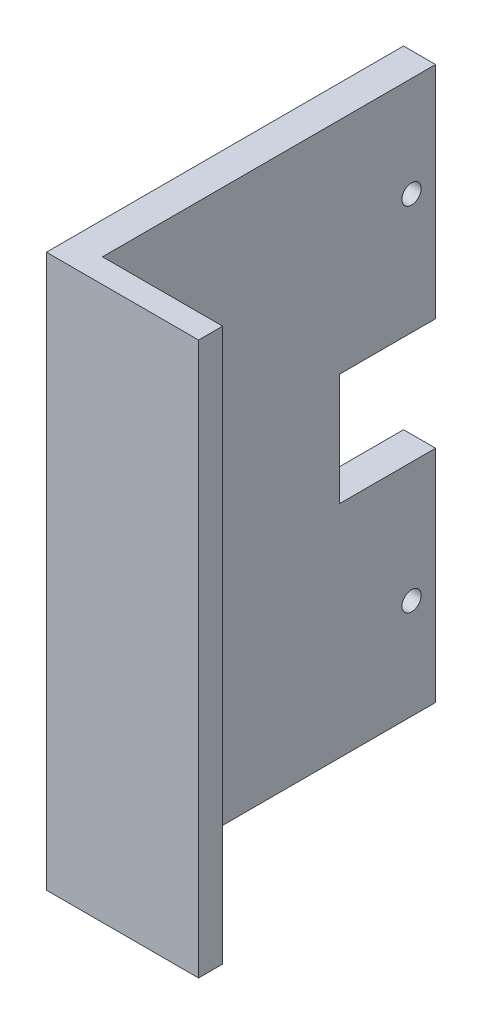
ISO-10303-21;
HEADER;
FILE_DESCRIPTION(('STEP AP214'),'2;1');
FILE_NAME('part.step','',(''),(''),'','','');
FILE_SCHEMA(('AUTOMOTIVE_DESIGN { 1 0 10303 214 1 1 1 1 }'));
ENDSEC;
DATA;
#1=APPLICATION_CONTEXT('core data for automotive mechanical design processes');
#2=APPLICATION_PROTOCOL_DEFINITION('international standard','automotive_design',2000,#1);
#3=PRODUCT_CONTEXT('',#1,'mechanical');
#4=PRODUCT('Part','Part','',(#3));
#5=PRODUCT_RELATED_PRODUCT_CATEGORY('part','',(#4));
#6=PRODUCT_DEFINITION_FORMATION('','',#4);
#7=PRODUCT_DEFINITION_CONTEXT('part definition',#1,'design');
#8=PRODUCT_DEFINITION('design','',#6,#7);
#9=PRODUCT_DEFINITION_SHAPE('','',#8);
#10=(LENGTH_UNIT() NAMED_UNIT(*) SI_UNIT(.MILLI.,.METRE.));
#11=(NAMED_UNIT(*) PLANE_ANGLE_UNIT() SI_UNIT($,.RADIAN.));
#12=(NAMED_UNIT(*) SI_UNIT($,.STERADIAN.) SOLID_ANGLE_UNIT());
#13=UNCERTAINTY_MEASURE_WITH_UNIT(LENGTH_MEASURE(1.E-05),#10,'distance_accuracy_value','');
#14=(GEOMETRIC_REPRESENTATION_CONTEXT(3) GLOBAL_UNCERTAINTY_ASSIGNED_CONTEXT((#13)) GLOBAL_UNIT_ASSIGNED_CONTEXT((#10,
#11,#12)) REPRESENTATION_CONTEXT('',''));
#15=CARTESIAN_POINT('',(0.,0.,0.));
#16=DIRECTION('',(0.,0.,1.));
#17=DIRECTION('',(1.,0.,0.));
#18=AXIS2_PLACEMENT_3D('',#15,#16,#17);
#19=CARTESIAN_POINT('',(14.2,-34.5,170.8));
#20=DIRECTION('',(-1.,0.,0.));
#21=DIRECTION('',(0.,0.,1.));
#22=AXIS2_PLACEMENT_3D('',#19,#20,#21);
#23=PLANE('',#22);
#24=CARTESIAN_POINT('',(14.2,22.,129.2));
#25=DIRECTION('',(-1.,0.,0.));
#26=DIRECTION('',(0.,0.,1.));
#27=AXIS2_PLACEMENT_3D('',#24,#25,#26);
#28=CIRCLE('',#27,1.20000000000001);
#29=CARTESIAN_POINT('',(14.2,22.,130.4));
#30=VERTEX_POINT('',#29);
#31=EDGE_CURVE('E205',#30,#30,#28,.F.);
#32=ORIENTED_EDGE('',*,*,#31,.F.);
#33=EDGE_LOOP('',(#32));
#34=FACE_BOUND('',#33,.T.);
#35=CARTESIAN_POINT('',(14.2,-22.,129.2));
#36=DIRECTION('',(-1.,0.,0.));
#37=DIRECTION('',(0.,0.,1.));
#38=AXIS2_PLACEMENT_3D('',#35,#36,#37);
#39=CIRCLE('',#38,1.20000000000001);
#40=CARTESIAN_POINT('',(14.2,-22.,130.4));
#41=VERTEX_POINT('',#40);
#42=EDGE_CURVE('E194',#41,#41,#39,.F.);
#43=ORIENTED_EDGE('',*,*,#42,.F.);
#44=EDGE_LOOP('',(#43));
#45=FACE_BOUND('',#44,.T.);
#46=DIRECTION('',(0.,0.,-1.));
#47=VECTOR('',#46,1.);
#48=CARTESIAN_POINT('',(14.2,-7.,170.8));
#49=LINE('',#48,#47);
#50=CARTESIAN_POINT('',(14.2,-7.,138.2));
#51=VERTEX_POINT('',#50);
#52=CARTESIAN_POINT('',(14.2,-7.,126.2));
#53=VERTEX_POINT('',#52);
#54=EDGE_CURVE('E132',#51,#53,#49,.T.);
#55=ORIENTED_EDGE('',*,*,#54,.F.);
#56=DIRECTION('',(0.,1.,0.));
#57=VECTOR('',#56,1.);
#58=CARTESIAN_POINT('',(14.2,-34.5,138.2));
#59=LINE('',#58,#57);
#60=CARTESIAN_POINT('',(14.2,7.,138.2));
#61=VERTEX_POINT('',#60);
#62=EDGE_CURVE('E129',#51,#61,#59,.T.);
#63=ORIENTED_EDGE('',*,*,#62,.T.);
#64=DIRECTION('',(0.,0.,1.));
#65=VECTOR('',#64,1.);
#66=CARTESIAN_POINT('',(14.2,7.,170.8));
#67=LINE('',#66,#65);
#68=CARTESIAN_POINT('',(14.2,7.,126.2));
#69=VERTEX_POINT('',#68);
#70=EDGE_CURVE('E120',#69,#61,#67,.T.);
#71=ORIENTED_EDGE('',*,*,#70,.F.);
#72=DIRECTION('',(0.,1.,0.));
#73=VECTOR('',#72,1.);
#74=CARTESIAN_POINT('',(14.2,-34.5,126.2));
#75=LINE('',#74,#73);
#76=CARTESIAN_POINT('',(14.2,34.5,126.2));
#77=VERTEX_POINT('',#76);
#78=EDGE_CURVE('E175',#69,#77,#75,.T.);
#79=ORIENTED_EDGE('',*,*,#78,.T.);
#80=DIRECTION('',(0.,0.,-1.));
#81=VECTOR('',#80,1.);
#82=CARTESIAN_POINT('',(14.2,34.5,170.8));
#83=LINE('',#82,#81);
#84=CARTESIAN_POINT('',(14.2,34.5,167.8));
#85=VERTEX_POINT('',#84);
#86=EDGE_CURVE('E177',#85,#77,#83,.T.);
#87=ORIENTED_EDGE('',*,*,#86,.F.);
#88=DIRECTION('',(0.,1.,0.));
#89=VECTOR('',#88,1.);
#90=CARTESIAN_POINT('',(14.2,-34.5,167.8));
#91=LINE('',#90,#89);
#92=CARTESIAN_POINT('',(14.2,-34.5,167.8));
#93=VERTEX_POINT('',#92);
#94=EDGE_CURVE('E64',#93,#85,#91,.T.);
#95=ORIENTED_EDGE('',*,*,#94,.F.);
#96=DIRECTION('',(0.,0.,-1.));
#97=VECTOR('',#96,1.);
#98=CARTESIAN_POINT('',(14.2,-34.5,170.8));
#99=LINE('',#98,#97);
#100=CARTESIAN_POINT('',(14.2,-34.5,126.2));
#101=VERTEX_POINT('',#100);
#102=EDGE_CURVE('E182',#93,#101,#99,.T.);
#103=ORIENTED_EDGE('',*,*,#102,.T.);
#104=EDGE_CURVE('E171',#101,#53,#75,.T.);
#105=ORIENTED_EDGE('',*,*,#104,.T.);
#106=EDGE_LOOP('',(#55,#63,#71,#79,#87,#95,#103,#105));
#107=FACE_BOUND('',#106,.T.);
#108=ADVANCED_FACE('F39',(#34,#45,#107),#23,.F.);
#109=CARTESIAN_POINT('',(10.2,34.5,170.8));
#110=DIRECTION('',(1.,0.,0.));
#111=DIRECTION('',(0.,0.,-1.));
#112=AXIS2_PLACEMENT_3D('',#109,#110,#111);
#113=PLANE('',#112);
#114=CARTESIAN_POINT('',(10.2,22.,129.2));
#115=DIRECTION('',(1.,0.,0.));
#116=DIRECTION('',(0.,0.,-1.));
#117=AXIS2_PLACEMENT_3D('',#114,#115,#116);
#118=CIRCLE('',#117,2.3);
#119=CARTESIAN_POINT('',(10.2,22.,126.9));
#120=VERTEX_POINT('',#119);
#121=EDGE_CURVE('E43',#120,#120,#118,.F.);
#122=ORIENTED_EDGE('',*,*,#121,.F.);
#123=EDGE_LOOP('',(#122));
#124=FACE_BOUND('',#123,.T.);
#125=CARTESIAN_POINT('',(10.2,-22.,129.2));
#126=DIRECTION('',(1.,0.,0.));
#127=DIRECTION('',(0.,0.,-1.));
#128=AXIS2_PLACEMENT_3D('',#125,#126,#127);
#129=CIRCLE('',#128,2.3);
#130=CARTESIAN_POINT('',(10.2,-22.,126.9));
#131=VERTEX_POINT('',#130);
#132=EDGE_CURVE('E195',#131,#131,#129,.F.);
#133=ORIENTED_EDGE('',*,*,#132,.F.);
#134=EDGE_LOOP('',(#133));
#135=FACE_BOUND('',#134,.T.);
#136=DIRECTION('',(0.,0.,1.));
#137=VECTOR('',#136,1.);
#138=CARTESIAN_POINT('',(10.2,-7.,170.8));
#139=LINE('',#138,#137);
#140=CARTESIAN_POINT('',(10.2,-7.,126.2));
#141=VERTEX_POINT('',#140);
#142=CARTESIAN_POINT('',(10.2,-7.,138.2));
#143=VERTEX_POINT('',#142);
#144=EDGE_CURVE('E123',#141,#143,#139,.T.);
#145=ORIENTED_EDGE('',*,*,#144,.F.);
#146=DIRECTION('',(0.,-1.,0.));
#147=VECTOR('',#146,1.);
#148=CARTESIAN_POINT('',(10.2,34.5,126.2));
#149=LINE('',#148,#147);
#150=CARTESIAN_POINT('',(10.2,-34.5,126.2));
#151=VERTEX_POINT('',#150);
#152=EDGE_CURVE('E156',#141,#151,#149,.T.);
#153=ORIENTED_EDGE('',*,*,#152,.T.);
#154=DIRECTION('',(0.,0.,-1.));
#155=VECTOR('',#154,1.);
#156=CARTESIAN_POINT('',(10.2,-34.5,170.8));
#157=LINE('',#156,#155);
#158=CARTESIAN_POINT('',(10.2,-34.5,170.8));
#159=VERTEX_POINT('',#158);
#160=EDGE_CURVE('E181',#159,#151,#157,.T.);
#161=ORIENTED_EDGE('',*,*,#160,.F.);
#162=DIRECTION('',(0.,-1.,0.));
#163=VECTOR('',#162,1.);
#164=CARTESIAN_POINT('',(10.2,34.5,170.8));
#165=LINE('',#164,#163);
#166=CARTESIAN_POINT('',(10.2,34.5,170.8));
#167=VERTEX_POINT('',#166);
#168=EDGE_CURVE('E160',#167,#159,#165,.T.);
#169=ORIENTED_EDGE('',*,*,#168,.F.);
#170=DIRECTION('',(0.,0.,-1.));
#171=VECTOR('',#170,1.);
#172=CARTESIAN_POINT('',(10.2,34.5,170.8));
#173=LINE('',#172,#171);
#174=CARTESIAN_POINT('',(10.2,34.5,126.2));
#175=VERTEX_POINT('',#174);
#176=EDGE_CURVE('E164',#167,#175,#173,.T.);
#177=ORIENTED_EDGE('',*,*,#176,.T.);
#178=CARTESIAN_POINT('',(10.2,7.,126.2));
#179=VERTEX_POINT('',#178);
#180=EDGE_CURVE('E167',#175,#179,#149,.T.);
#181=ORIENTED_EDGE('',*,*,#180,.T.);
#182=DIRECTION('',(0.,0.,-1.));
#183=VECTOR('',#182,1.);
#184=CARTESIAN_POINT('',(10.2,7.,170.8));
#185=LINE('',#184,#183);
#186=CARTESIAN_POINT('',(10.2,7.,138.2));
#187=VERTEX_POINT('',#186);
#188=EDGE_CURVE('E57',#187,#179,#185,.T.);
#189=ORIENTED_EDGE('',*,*,#188,.F.);
#190=DIRECTION('',(0.,-1.,0.));
#191=VECTOR('',#190,1.);
#192=CARTESIAN_POINT('',(10.2,34.5,138.2));
#193=LINE('',#192,#191);
#194=EDGE_CURVE('E11',#187,#143,#193,.T.);
#195=ORIENTED_EDGE('',*,*,#194,.T.);
#196=EDGE_LOOP('',(#145,#153,#161,#169,#177,#181,#189,#195));
#197=FACE_BOUND('',#196,.T.);
#198=ADVANCED_FACE('F41',(#124,#135,#197),#113,.F.);
#199=CARTESIAN_POINT('',(0.,0.,126.2));
#200=DIRECTION('',(0.,0.,1.));
#201=DIRECTION('',(1.,0.,0.));
#202=AXIS2_PLACEMENT_3D('',#199,#200,#201);
#203=PLANE('',#202);
#204=DIRECTION('',(-1.,0.,0.));
#205=VECTOR('',#204,1.);
#206=CARTESIAN_POINT('',(0.,-7.,126.2));
#207=LINE('',#206,#205);
#208=EDGE_CURVE('E48',#53,#141,#207,.T.);
#209=ORIENTED_EDGE('',*,*,#208,.F.);
#210=ORIENTED_EDGE('',*,*,#104,.F.);
#211=DIRECTION('',(1.,0.,0.));
#212=VECTOR('',#211,1.);
#213=CARTESIAN_POINT('',(10.2,-34.5,126.2));
#214=LINE('',#213,#212);
#215=EDGE_CURVE('E166',#151,#101,#214,.T.);
#216=ORIENTED_EDGE('',*,*,#215,.F.);
#217=ORIENTED_EDGE('',*,*,#152,.F.);
#218=EDGE_LOOP('',(#209,#210,#216,#217));
#219=FACE_BOUND('',#218,.T.);
#220=ADVANCED_FACE('F250',(#219),#203,.F.);
#221=DIRECTION('',(1.,0.,0.));
#222=VECTOR('',#221,1.);
#223=CARTESIAN_POINT('',(0.,7.,126.2));
#224=LINE('',#223,#222);
#225=EDGE_CURVE('E121',#179,#69,#224,.T.);
#226=ORIENTED_EDGE('',*,*,#225,.F.);
#227=ORIENTED_EDGE('',*,*,#180,.F.);
#228=DIRECTION('',(-1.,0.,0.));
#229=VECTOR('',#228,1.);
#230=CARTESIAN_POINT('',(14.2,34.5,126.2));
#231=LINE('',#230,#229);
#232=EDGE_CURVE('E161',#77,#175,#231,.T.);
#233=ORIENTED_EDGE('',*,*,#232,.F.);
#234=ORIENTED_EDGE('',*,*,#78,.F.);
#235=EDGE_LOOP('',(#226,#227,#233,#234));
#236=FACE_BOUND('',#235,.T.);
#237=ADVANCED_FACE('F228',(#236),#203,.F.);
#238=CARTESIAN_POINT('',(10.2,-34.5,170.8));
#239=DIRECTION('',(0.,1.,0.));
#240=DIRECTION('',(0.,0.,1.));
#241=AXIS2_PLACEMENT_3D('',#238,#239,#240);
#242=PLANE('',#241);
#243=ORIENTED_EDGE('',*,*,#160,.T.);
#244=ORIENTED_EDGE('',*,*,#215,.T.);
#245=ORIENTED_EDGE('',*,*,#102,.F.);
#246=DIRECTION('',(1.,0.,0.));
#247=VECTOR('',#246,1.);
#248=CARTESIAN_POINT('',(10.2,-34.5,167.8));
#249=LINE('',#248,#247);
#250=CARTESIAN_POINT('',(29.2,-34.5,167.8));
#251=VERTEX_POINT('',#250);
#252=EDGE_CURVE('E136',#93,#251,#249,.T.);
#253=ORIENTED_EDGE('',*,*,#252,.T.);
#254=DIRECTION('',(0.,0.,-1.));
#255=VECTOR('',#254,1.);
#256=CARTESIAN_POINT('',(29.2,-34.5,170.8));
#257=LINE('',#256,#255);
#258=CARTESIAN_POINT('',(29.2,-34.5,170.8));
#259=VERTEX_POINT('',#258);
#260=EDGE_CURVE('E153',#259,#251,#257,.T.);
#261=ORIENTED_EDGE('',*,*,#260,.F.);
#262=DIRECTION('',(1.,0.,0.));
#263=VECTOR('',#262,1.);
#264=CARTESIAN_POINT('',(10.2,-34.5,170.8));
#265=LINE('',#264,#263);
#266=EDGE_CURVE('E159',#159,#259,#265,.T.);
#267=ORIENTED_EDGE('',*,*,#266,.F.);
#268=EDGE_LOOP('',(#243,#244,#245,#253,#261,#267));
#269=FACE_BOUND('',#268,.T.);
#270=ADVANCED_FACE('F240',(#269),#242,.F.);
#271=CARTESIAN_POINT('',(14.2,34.5,170.8));
#272=DIRECTION('',(0.,-1.,0.));
#273=DIRECTION('',(0.,0.,-1.));
#274=AXIS2_PLACEMENT_3D('',#271,#272,#273);
#275=PLANE('',#274);
#276=DIRECTION('',(-1.,0.,0.));
#277=VECTOR('',#276,1.);
#278=CARTESIAN_POINT('',(14.2,34.5,170.8));
#279=LINE('',#278,#277);
#280=CARTESIAN_POINT('',(29.2,34.5,170.8));
#281=VERTEX_POINT('',#280);
#282=EDGE_CURVE('E162',#281,#167,#279,.T.);
#283=ORIENTED_EDGE('',*,*,#282,.F.);
#284=DIRECTION('',(0.,0.,-1.));
#285=VECTOR('',#284,1.);
#286=CARTESIAN_POINT('',(29.2,34.5,170.8));
#287=LINE('',#286,#285);
#288=CARTESIAN_POINT('',(29.2,34.5,167.8));
#289=VERTEX_POINT('',#288);
#290=EDGE_CURVE('E144',#281,#289,#287,.T.);
#291=ORIENTED_EDGE('',*,*,#290,.T.);
#292=DIRECTION('',(-1.,0.,0.));
#293=VECTOR('',#292,1.);
#294=CARTESIAN_POINT('',(29.2,34.5,167.8));
#295=LINE('',#294,#293);
#296=EDGE_CURVE('E148',#289,#85,#295,.T.);
#297=ORIENTED_EDGE('',*,*,#296,.T.);
#298=ORIENTED_EDGE('',*,*,#86,.T.);
#299=ORIENTED_EDGE('',*,*,#232,.T.);
#300=ORIENTED_EDGE('',*,*,#176,.F.);
#301=EDGE_LOOP('',(#283,#291,#297,#298,#299,#300));
#302=FACE_BOUND('',#301,.T.);
#303=ADVANCED_FACE('F226',(#302),#275,.F.);
#304=CARTESIAN_POINT('',(0.,0.,170.8));
#305=DIRECTION('',(0.,0.,1.));
#306=DIRECTION('',(1.,0.,0.));
#307=AXIS2_PLACEMENT_3D('',#304,#305,#306);
#308=PLANE('',#307);
#309=ORIENTED_EDGE('',*,*,#168,.T.);
#310=ORIENTED_EDGE('',*,*,#266,.T.);
#311=DIRECTION('',(0.,1.,0.));
#312=VECTOR('',#311,1.);
#313=CARTESIAN_POINT('',(29.2,-34.5,170.8));
#314=LINE('',#313,#312);
#315=EDGE_CURVE('E141',#259,#281,#314,.T.);
#316=ORIENTED_EDGE('',*,*,#315,.T.);
#317=ORIENTED_EDGE('',*,*,#282,.T.);
#318=EDGE_LOOP('',(#309,#310,#316,#317));
#319=FACE_BOUND('',#318,.T.);
#320=ADVANCED_FACE('F245',(#319),#308,.T.);
#321=CARTESIAN_POINT('',(0.,0.,167.8));
#322=DIRECTION('',(0.,0.,1.));
#323=DIRECTION('',(1.,0.,0.));
#324=AXIS2_PLACEMENT_3D('',#321,#322,#323);
#325=PLANE('',#324);
#326=ORIENTED_EDGE('',*,*,#252,.F.);
#327=ORIENTED_EDGE('',*,*,#94,.T.);
#328=ORIENTED_EDGE('',*,*,#296,.F.);
#329=DIRECTION('',(0.,1.,0.));
#330=VECTOR('',#329,1.);
#331=CARTESIAN_POINT('',(29.2,-34.5,167.8));
#332=LINE('',#331,#330);
#333=EDGE_CURVE('E137',#251,#289,#332,.T.);
#334=ORIENTED_EDGE('',*,*,#333,.F.);
#335=EDGE_LOOP('',(#326,#327,#328,#334));
#336=FACE_BOUND('',#335,.T.);
#337=ADVANCED_FACE('F233',(#336),#325,.F.);
#338=CARTESIAN_POINT('',(29.2,-34.5,170.8));
#339=DIRECTION('',(-1.,0.,0.));
#340=DIRECTION('',(0.,0.,1.));
#341=AXIS2_PLACEMENT_3D('',#338,#339,#340);
#342=PLANE('',#341);
#343=ORIENTED_EDGE('',*,*,#333,.T.);
#344=ORIENTED_EDGE('',*,*,#290,.F.);
#345=ORIENTED_EDGE('',*,*,#315,.F.);
#346=ORIENTED_EDGE('',*,*,#260,.T.);
#347=EDGE_LOOP('',(#343,#344,#345,#346));
#348=FACE_BOUND('',#347,.T.);
#349=ADVANCED_FACE('F238',(#348),#342,.F.);
#350=CARTESIAN_POINT('',(0.,0.,138.2));
#351=DIRECTION('',(0.,0.,1.));
#352=DIRECTION('',(1.,0.,0.));
#353=AXIS2_PLACEMENT_3D('',#350,#351,#352);
#354=PLANE('',#353);
#355=DIRECTION('',(1.,0.,0.));
#356=VECTOR('',#355,1.);
#357=CARTESIAN_POINT('',(10.1,-7.,138.2));
#358=LINE('',#357,#356);
#359=EDGE_CURVE('E133',#143,#51,#358,.T.);
#360=ORIENTED_EDGE('',*,*,#359,.F.);
#361=ORIENTED_EDGE('',*,*,#194,.F.);
#362=DIRECTION('',(-1.,0.,0.));
#363=VECTOR('',#362,1.);
#364=CARTESIAN_POINT('',(14.3,7.,138.2));
#365=LINE('',#364,#363);
#366=EDGE_CURVE('E117',#61,#187,#365,.T.);
#367=ORIENTED_EDGE('',*,*,#366,.F.);
#368=ORIENTED_EDGE('',*,*,#62,.F.);
#369=EDGE_LOOP('',(#360,#361,#367,#368));
#370=FACE_BOUND('',#369,.T.);
#371=ADVANCED_FACE('F126',(#370),#354,.F.);
#372=CARTESIAN_POINT('',(10.1,-7.,138.2));
#373=DIRECTION('',(0.,1.,0.));
#374=DIRECTION('',(0.,0.,1.));
#375=AXIS2_PLACEMENT_3D('',#372,#373,#374);
#376=PLANE('',#375);
#377=ORIENTED_EDGE('',*,*,#54,.T.);
#378=ORIENTED_EDGE('',*,*,#208,.T.);
#379=ORIENTED_EDGE('',*,*,#144,.T.);
#380=ORIENTED_EDGE('',*,*,#359,.T.);
#381=EDGE_LOOP('',(#377,#378,#379,#380));
#382=FACE_BOUND('',#381,.T.);
#383=ADVANCED_FACE('F220',(#382),#376,.T.);
#384=CARTESIAN_POINT('',(14.3,7.,138.2));
#385=DIRECTION('',(0.,-1.,0.));
#386=DIRECTION('',(0.,0.,-1.));
#387=AXIS2_PLACEMENT_3D('',#384,#385,#386);
#388=PLANE('',#387);
#389=ORIENTED_EDGE('',*,*,#70,.T.);
#390=ORIENTED_EDGE('',*,*,#366,.T.);
#391=ORIENTED_EDGE('',*,*,#188,.T.);
#392=ORIENTED_EDGE('',*,*,#225,.T.);
#393=EDGE_LOOP('',(#389,#390,#391,#392));
#394=FACE_BOUND('',#393,.T.);
#395=ADVANCED_FACE('F119',(#394),#388,.T.);
#396=CARTESIAN_POINT('',(14.3,-22.,129.2));
#397=DIRECTION('',(-1.,0.,0.));
#398=DIRECTION('',(0.,0.,1.));
#399=AXIS2_PLACEMENT_3D('',#396,#397,#398);
#400=CYLINDRICAL_SURFACE('',#399,1.20000000000001);
#401=CARTESIAN_POINT('',(11.5,-22.,129.2));
#402=DIRECTION('',(1.,0.,0.));
#403=DIRECTION('',(0.,0.,-1.));
#404=AXIS2_PLACEMENT_3D('',#401,#402,#403);
#405=CIRCLE('',#404,1.20000000000001);
#406=CARTESIAN_POINT('',(11.5,-22.,128.));
#407=VERTEX_POINT('',#406);
#408=EDGE_CURVE('E189',#407,#407,#405,.T.);
#409=ORIENTED_EDGE('',*,*,#408,.F.);
#410=EDGE_LOOP('',(#409));
#411=FACE_BOUND('',#410,.T.);
#412=ORIENTED_EDGE('',*,*,#42,.T.);
#413=EDGE_LOOP('',(#412));
#414=FACE_BOUND('',#413,.T.);
#415=ADVANCED_FACE('F281',(#411,#414),#400,.F.);
#416=CARTESIAN_POINT('',(11.5,-22.,129.2));
#417=DIRECTION('',(-1.,0.,0.));
#418=DIRECTION('',(0.,0.,1.));
#419=AXIS2_PLACEMENT_3D('',#416,#417,#418);
#420=CYLINDRICAL_SURFACE('',#419,2.3);
#421=CARTESIAN_POINT('',(11.5,-22.,129.2));
#422=DIRECTION('',(1.,0.,0.));
#423=DIRECTION('',(0.,0.,-1.));
#424=AXIS2_PLACEMENT_3D('',#421,#422,#423);
#425=CIRCLE('',#424,2.3);
#426=CARTESIAN_POINT('',(11.5,-22.,126.9));
#427=VERTEX_POINT('',#426);
#428=EDGE_CURVE('E192',#427,#427,#425,.T.);
#429=ORIENTED_EDGE('',*,*,#428,.T.);
#430=EDGE_LOOP('',(#429));
#431=FACE_BOUND('',#430,.T.);
#432=ORIENTED_EDGE('',*,*,#132,.T.);
#433=EDGE_LOOP('',(#432));
#434=FACE_BOUND('',#433,.T.);
#435=ADVANCED_FACE('F287',(#431,#434),#420,.F.);
#436=CARTESIAN_POINT('',(11.5,-22.,129.2));
#437=DIRECTION('',(1.,0.,0.));
#438=DIRECTION('',(0.,0.,-1.));
#439=AXIS2_PLACEMENT_3D('',#436,#437,#438);
#440=PLANE('',#439);
#441=ORIENTED_EDGE('',*,*,#408,.T.);
#442=EDGE_LOOP('',(#441));
#443=FACE_BOUND('',#442,.T.);
#444=ORIENTED_EDGE('',*,*,#428,.F.);
#445=EDGE_LOOP('',(#444));
#446=FACE_BOUND('',#445,.T.);
#447=ADVANCED_FACE('F295',(#443,#446),#440,.F.);
#448=CARTESIAN_POINT('',(14.3,22.,129.2));
#449=DIRECTION('',(-1.,0.,0.));
#450=DIRECTION('',(0.,0.,1.));
#451=AXIS2_PLACEMENT_3D('',#448,#449,#450);
#452=CYLINDRICAL_SURFACE('',#451,1.20000000000001);
#453=CARTESIAN_POINT('',(11.5,22.,129.2));
#454=DIRECTION('',(1.,0.,0.));
#455=DIRECTION('',(0.,0.,-1.));
#456=AXIS2_PLACEMENT_3D('',#453,#454,#455);
#457=CIRCLE('',#456,1.20000000000001);
#458=CARTESIAN_POINT('',(11.5,22.,128.));
#459=VERTEX_POINT('',#458);
#460=EDGE_CURVE('E198',#459,#459,#457,.T.);
#461=ORIENTED_EDGE('',*,*,#460,.F.);
#462=EDGE_LOOP('',(#461));
#463=FACE_BOUND('',#462,.T.);
#464=ORIENTED_EDGE('',*,*,#31,.T.);
#465=EDGE_LOOP('',(#464));
#466=FACE_BOUND('',#465,.T.);
#467=ADVANCED_FACE('F293',(#463,#466),#452,.F.);
#468=CARTESIAN_POINT('',(11.5,22.,129.2));
#469=DIRECTION('',(-1.,0.,0.));
#470=DIRECTION('',(0.,0.,1.));
#471=AXIS2_PLACEMENT_3D('',#468,#469,#470);
#472=CYLINDRICAL_SURFACE('',#471,2.3);
#473=CARTESIAN_POINT('',(11.5,22.,129.2));
#474=DIRECTION('',(1.,0.,0.));
#475=DIRECTION('',(0.,0.,-1.));
#476=AXIS2_PLACEMENT_3D('',#473,#474,#475);
#477=CIRCLE('',#476,2.3);
#478=CARTESIAN_POINT('',(11.5,22.,126.9));
#479=VERTEX_POINT('',#478);
#480=EDGE_CURVE('E196',#479,#479,#477,.T.);
#481=ORIENTED_EDGE('',*,*,#480,.T.);
#482=EDGE_LOOP('',(#481));
#483=FACE_BOUND('',#482,.T.);
#484=ORIENTED_EDGE('',*,*,#121,.T.);
#485=EDGE_LOOP('',(#484));
#486=FACE_BOUND('',#485,.T.);
#487=ADVANCED_FACE('F299',(#483,#486),#472,.F.);
#488=CARTESIAN_POINT('',(11.5,22.,129.2));
#489=DIRECTION('',(1.,0.,0.));
#490=DIRECTION('',(0.,0.,-1.));
#491=AXIS2_PLACEMENT_3D('',#488,#489,#490);
#492=PLANE('',#491);
#493=ORIENTED_EDGE('',*,*,#460,.T.);
#494=EDGE_LOOP('',(#493));
#495=FACE_BOUND('',#494,.T.);
#496=ORIENTED_EDGE('',*,*,#480,.F.);
#497=EDGE_LOOP('',(#496));
#498=FACE_BOUND('',#497,.T.);
#499=ADVANCED_FACE('F302',(#495,#498),#492,.F.);
#500=CLOSED_SHELL('',(#108,#198,#220,#237,#270,#303,#320,#337,#349,#371,#383,#395,#415,#435,
#447,#467,#487,#499));
#501=MANIFOLD_SOLID_BREP('B2',#500);
#502=ADVANCED_BREP_SHAPE_REPRESENTATION('',(#18,#501),#14);
#503=SHAPE_DEFINITION_REPRESENTATION(#9,#502);
ENDSEC;
END-ISO-10303-21;
